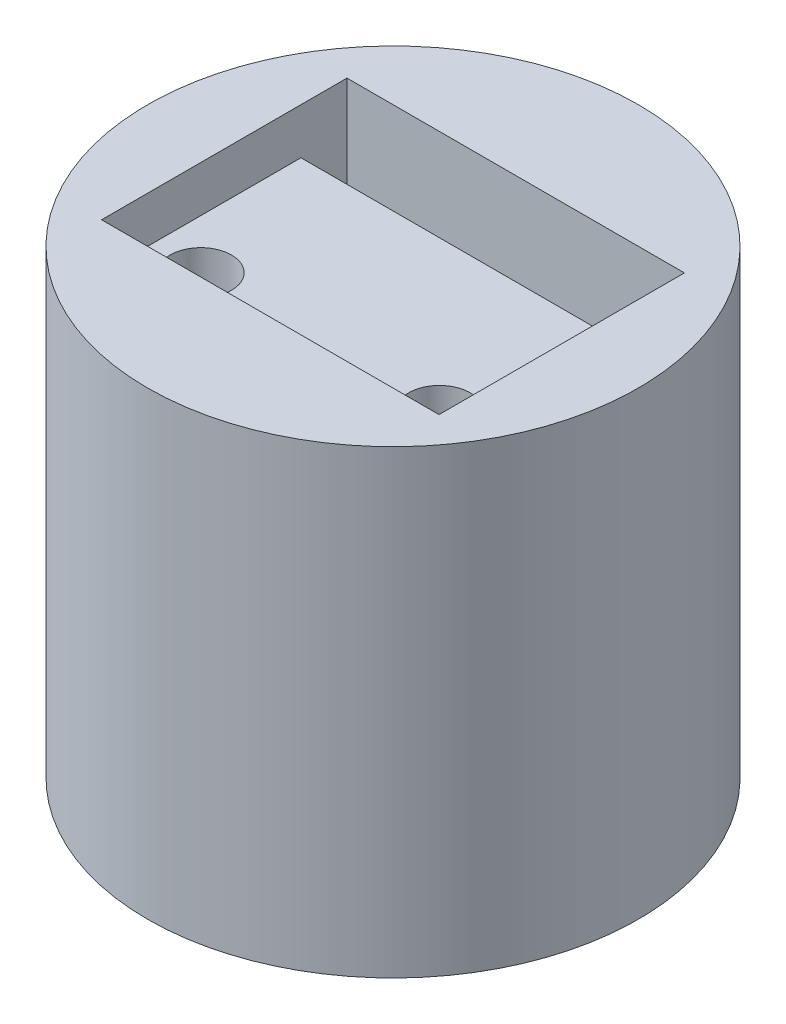
ISO-10303-21;
HEADER;
FILE_DESCRIPTION(('STEP AP214'),'2;1');
FILE_NAME('part.step','',(''),(''),'','','');
FILE_SCHEMA(('AUTOMOTIVE_DESIGN { 1 0 10303 214 1 1 1 1 }'));
ENDSEC;
DATA;
#1=APPLICATION_CONTEXT('core data for automotive mechanical design processes');
#2=APPLICATION_PROTOCOL_DEFINITION('international standard','automotive_design',2000,#1);
#3=PRODUCT_CONTEXT('',#1,'mechanical');
#4=PRODUCT('Part','Part','',(#3));
#5=PRODUCT_RELATED_PRODUCT_CATEGORY('part','',(#4));
#6=PRODUCT_DEFINITION_FORMATION('','',#4);
#7=PRODUCT_DEFINITION_CONTEXT('part definition',#1,'design');
#8=PRODUCT_DEFINITION('design','',#6,#7);
#9=PRODUCT_DEFINITION_SHAPE('','',#8);
#10=(LENGTH_UNIT() NAMED_UNIT(*) SI_UNIT(.MILLI.,.METRE.));
#11=(NAMED_UNIT(*) PLANE_ANGLE_UNIT() SI_UNIT($,.RADIAN.));
#12=(NAMED_UNIT(*) SI_UNIT($,.STERADIAN.) SOLID_ANGLE_UNIT());
#13=UNCERTAINTY_MEASURE_WITH_UNIT(LENGTH_MEASURE(1.E-05),#10,'distance_accuracy_value','');
#14=(GEOMETRIC_REPRESENTATION_CONTEXT(3) GLOBAL_UNCERTAINTY_ASSIGNED_CONTEXT((#13)) GLOBAL_UNIT_ASSIGNED_CONTEXT((#10,
#11,#12)) REPRESENTATION_CONTEXT('',''));
#15=CARTESIAN_POINT('',(0.,0.,0.));
#16=DIRECTION('',(0.,0.,1.));
#17=DIRECTION('',(1.,0.,0.));
#18=AXIS2_PLACEMENT_3D('',#15,#16,#17);
#19=CARTESIAN_POINT('',(0.,30.,0.));
#20=DIRECTION('',(0.,-1.,0.));
#21=DIRECTION('',(0.,0.,-1.));
#22=AXIS2_PLACEMENT_3D('',#19,#20,#21);
#23=CYLINDRICAL_SURFACE('',#22,16.);
#24=CARTESIAN_POINT('',(0.,30.,0.));
#25=DIRECTION('',(0.,1.,0.));
#26=DIRECTION('',(0.,0.,1.));
#27=AXIS2_PLACEMENT_3D('',#24,#25,#26);
#28=CIRCLE('',#27,16.);
#29=CARTESIAN_POINT('',(0.,30.,16.));
#30=VERTEX_POINT('',#29);
#31=EDGE_CURVE('E11',#30,#30,#28,.T.);
#32=ORIENTED_EDGE('',*,*,#31,.F.);
#33=EDGE_LOOP('',(#32));
#34=FACE_BOUND('',#33,.T.);
#35=CARTESIAN_POINT('',(0.,0.,0.));
#36=DIRECTION('',(0.,1.,0.));
#37=DIRECTION('',(0.,0.,1.));
#38=AXIS2_PLACEMENT_3D('',#35,#36,#37);
#39=CIRCLE('',#38,16.);
#40=CARTESIAN_POINT('',(0.,0.,16.));
#41=VERTEX_POINT('',#40);
#42=EDGE_CURVE('E40',#41,#41,#39,.T.);
#43=ORIENTED_EDGE('',*,*,#42,.T.);
#44=EDGE_LOOP('',(#43));
#45=FACE_BOUND('',#44,.T.);
#46=ADVANCED_FACE('F37',(#34,#45),#23,.T.);
#47=CARTESIAN_POINT('',(0.,30.,0.));
#48=DIRECTION('',(0.,1.,0.));
#49=DIRECTION('',(0.,0.,1.));
#50=AXIS2_PLACEMENT_3D('',#47,#48,#49);
#51=PLANE('',#50);
#52=DIRECTION('',(0.,0.,1.));
#53=VECTOR('',#52,1.);
#54=CARTESIAN_POINT('',(-11.,30.,8.));
#55=LINE('',#54,#53);
#56=CARTESIAN_POINT('',(-11.,30.,-8.));
#57=VERTEX_POINT('',#56);
#58=CARTESIAN_POINT('',(-11.,30.,8.));
#59=VERTEX_POINT('',#58);
#60=EDGE_CURVE('E59',#57,#59,#55,.T.);
#61=ORIENTED_EDGE('',*,*,#60,.F.);
#62=DIRECTION('',(-1.,0.,0.));
#63=VECTOR('',#62,1.);
#64=CARTESIAN_POINT('',(11.,30.,-8.));
#65=LINE('',#64,#63);
#66=CARTESIAN_POINT('',(11.,30.,-8.));
#67=VERTEX_POINT('',#66);
#68=EDGE_CURVE('E129',#67,#57,#65,.T.);
#69=ORIENTED_EDGE('',*,*,#68,.F.);
#70=DIRECTION('',(0.,0.,-1.));
#71=VECTOR('',#70,1.);
#72=CARTESIAN_POINT('',(11.,30.,8.));
#73=LINE('',#72,#71);
#74=CARTESIAN_POINT('',(11.,30.,8.));
#75=VERTEX_POINT('',#74);
#76=EDGE_CURVE('E140',#75,#67,#73,.T.);
#77=ORIENTED_EDGE('',*,*,#76,.F.);
#78=DIRECTION('',(1.,0.,0.));
#79=VECTOR('',#78,1.);
#80=CARTESIAN_POINT('',(11.,30.,8.));
#81=LINE('',#80,#79);
#82=EDGE_CURVE('E137',#59,#75,#81,.T.);
#83=ORIENTED_EDGE('',*,*,#82,.F.);
#84=EDGE_LOOP('',(#61,#69,#77,#83));
#85=FACE_BOUND('',#84,.T.);
#86=ORIENTED_EDGE('',*,*,#31,.T.);
#87=EDGE_LOOP('',(#86));
#88=FACE_BOUND('',#87,.T.);
#89=ADVANCED_FACE('F157',(#85,#88),#51,.T.);
#90=CARTESIAN_POINT('',(0.,0.,0.));
#91=DIRECTION('',(0.,1.,0.));
#92=DIRECTION('',(0.,0.,1.));
#93=AXIS2_PLACEMENT_3D('',#90,#91,#92);
#94=PLANE('',#93);
#95=ORIENTED_EDGE('',*,*,#42,.F.);
#96=EDGE_LOOP('',(#95));
#97=FACE_BOUND('',#96,.T.);
#98=ADVANCED_FACE('F189',(#97),#94,.F.);
#99=CARTESIAN_POINT('',(-11.,27.,8.));
#100=DIRECTION('',(-1.,0.,0.));
#101=DIRECTION('',(0.,0.,1.));
#102=AXIS2_PLACEMENT_3D('',#99,#100,#101);
#103=PLANE('',#102);
#104=ORIENTED_EDGE('',*,*,#60,.T.);
#105=DIRECTION('',(0.,1.,0.));
#106=VECTOR('',#105,1.);
#107=CARTESIAN_POINT('',(-11.,27.,8.));
#108=LINE('',#107,#106);
#109=CARTESIAN_POINT('',(-11.,27.,8.));
#110=VERTEX_POINT('',#109);
#111=EDGE_CURVE('E135',#110,#59,#108,.T.);
#112=ORIENTED_EDGE('',*,*,#111,.F.);
#113=DIRECTION('',(0.,0.,1.));
#114=VECTOR('',#113,1.);
#115=CARTESIAN_POINT('',(-11.,27.,8.));
#116=LINE('',#115,#114);
#117=CARTESIAN_POINT('',(-11.,27.,-5.));
#118=VERTEX_POINT('',#117);
#119=EDGE_CURVE('E94',#118,#110,#116,.T.);
#120=ORIENTED_EDGE('',*,*,#119,.F.);
#121=DIRECTION('',(0.,1.,0.));
#122=VECTOR('',#121,1.);
#123=CARTESIAN_POINT('',(-11.,18.24,-5.));
#124=LINE('',#123,#122);
#125=CARTESIAN_POINT('',(-11.,18.24,-5.));
#126=VERTEX_POINT('',#125);
#127=EDGE_CURVE('E51',#126,#118,#124,.T.);
#128=ORIENTED_EDGE('',*,*,#127,.F.);
#129=DIRECTION('',(0.,0.,1.));
#130=VECTOR('',#129,1.);
#131=CARTESIAN_POINT('',(-11.,18.24,-8.));
#132=LINE('',#131,#130);
#133=CARTESIAN_POINT('',(-11.,18.24,-8.));
#134=VERTEX_POINT('',#133);
#135=EDGE_CURVE('E92',#134,#126,#132,.T.);
#136=ORIENTED_EDGE('',*,*,#135,.F.);
#137=DIRECTION('',(0.,1.,0.));
#138=VECTOR('',#137,1.);
#139=CARTESIAN_POINT('',(-11.,27.,-8.));
#140=LINE('',#139,#138);
#141=EDGE_CURVE('E145',#134,#57,#140,.T.);
#142=ORIENTED_EDGE('',*,*,#141,.T.);
#143=EDGE_LOOP('',(#104,#112,#120,#128,#136,#142));
#144=FACE_BOUND('',#143,.T.);
#145=ADVANCED_FACE('F90',(#144),#103,.F.);
#146=CARTESIAN_POINT('',(11.,27.,-8.));
#147=DIRECTION('',(0.,0.,-1.));
#148=DIRECTION('',(-1.,0.,0.));
#149=AXIS2_PLACEMENT_3D('',#146,#147,#148);
#150=PLANE('',#149);
#151=ORIENTED_EDGE('',*,*,#68,.T.);
#152=ORIENTED_EDGE('',*,*,#141,.F.);
#153=DIRECTION('',(-1.,0.,0.));
#154=VECTOR('',#153,1.);
#155=CARTESIAN_POINT('',(-11.,18.24,-8.));
#156=LINE('',#155,#154);
#157=CARTESIAN_POINT('',(11.,18.24,-8.));
#158=VERTEX_POINT('',#157);
#159=EDGE_CURVE('E96',#158,#134,#156,.T.);
#160=ORIENTED_EDGE('',*,*,#159,.F.);
#161=DIRECTION('',(0.,1.,0.));
#162=VECTOR('',#161,1.);
#163=CARTESIAN_POINT('',(11.,27.,-8.));
#164=LINE('',#163,#162);
#165=EDGE_CURVE('E147',#158,#67,#164,.T.);
#166=ORIENTED_EDGE('',*,*,#165,.T.);
#167=EDGE_LOOP('',(#151,#152,#160,#166));
#168=FACE_BOUND('',#167,.T.);
#169=ADVANCED_FACE('F200',(#168),#150,.F.);
#170=CARTESIAN_POINT('',(11.,27.,8.));
#171=DIRECTION('',(1.,0.,0.));
#172=DIRECTION('',(0.,0.,-1.));
#173=AXIS2_PLACEMENT_3D('',#170,#171,#172);
#174=PLANE('',#173);
#175=ORIENTED_EDGE('',*,*,#76,.T.);
#176=ORIENTED_EDGE('',*,*,#165,.F.);
#177=DIRECTION('',(0.,0.,-1.));
#178=VECTOR('',#177,1.);
#179=CARTESIAN_POINT('',(11.,18.24,-8.));
#180=LINE('',#179,#178);
#181=CARTESIAN_POINT('',(11.,18.24,-5.));
#182=VERTEX_POINT('',#181);
#183=EDGE_CURVE('E104',#182,#158,#180,.T.);
#184=ORIENTED_EDGE('',*,*,#183,.F.);
#185=DIRECTION('',(0.,1.,0.));
#186=VECTOR('',#185,1.);
#187=CARTESIAN_POINT('',(11.,18.24,-5.));
#188=LINE('',#187,#186);
#189=CARTESIAN_POINT('',(11.,27.,-5.));
#190=VERTEX_POINT('',#189);
#191=EDGE_CURVE('E95',#182,#190,#188,.T.);
#192=ORIENTED_EDGE('',*,*,#191,.T.);
#193=DIRECTION('',(0.,0.,-1.));
#194=VECTOR('',#193,1.);
#195=CARTESIAN_POINT('',(11.,27.,8.));
#196=LINE('',#195,#194);
#197=CARTESIAN_POINT('',(11.,27.,8.));
#198=VERTEX_POINT('',#197);
#199=EDGE_CURVE('E132',#198,#190,#196,.T.);
#200=ORIENTED_EDGE('',*,*,#199,.F.);
#201=DIRECTION('',(0.,1.,0.));
#202=VECTOR('',#201,1.);
#203=CARTESIAN_POINT('',(11.,27.,8.));
#204=LINE('',#203,#202);
#205=EDGE_CURVE('E149',#198,#75,#204,.T.);
#206=ORIENTED_EDGE('',*,*,#205,.T.);
#207=EDGE_LOOP('',(#175,#176,#184,#192,#200,#206));
#208=FACE_BOUND('',#207,.T.);
#209=ADVANCED_FACE('F161',(#208),#174,.F.);
#210=CARTESIAN_POINT('',(11.,27.,8.));
#211=DIRECTION('',(0.,0.,1.));
#212=DIRECTION('',(1.,0.,0.));
#213=AXIS2_PLACEMENT_3D('',#210,#211,#212);
#214=PLANE('',#213);
#215=ORIENTED_EDGE('',*,*,#82,.T.);
#216=ORIENTED_EDGE('',*,*,#205,.F.);
#217=DIRECTION('',(1.,0.,0.));
#218=VECTOR('',#217,1.);
#219=CARTESIAN_POINT('',(11.,27.,8.));
#220=LINE('',#219,#218);
#221=EDGE_CURVE('E128',#110,#198,#220,.T.);
#222=ORIENTED_EDGE('',*,*,#221,.F.);
#223=ORIENTED_EDGE('',*,*,#111,.T.);
#224=EDGE_LOOP('',(#215,#216,#222,#223));
#225=FACE_BOUND('',#224,.T.);
#226=ADVANCED_FACE('F154',(#225),#214,.F.);
#227=CARTESIAN_POINT('',(0.,27.,0.));
#228=DIRECTION('',(0.,1.,0.));
#229=DIRECTION('',(0.,0.,1.));
#230=AXIS2_PLACEMENT_3D('',#227,#228,#229);
#231=PLANE('',#230);
#232=DIRECTION('',(1.,0.,0.));
#233=VECTOR('',#232,1.);
#234=CARTESIAN_POINT('',(-11.,27.,-5.));
#235=LINE('',#234,#233);
#236=EDGE_CURVE('E108',#118,#190,#235,.T.);
#237=ORIENTED_EDGE('',*,*,#236,.F.);
#238=ORIENTED_EDGE('',*,*,#119,.T.);
#239=ORIENTED_EDGE('',*,*,#221,.T.);
#240=ORIENTED_EDGE('',*,*,#199,.T.);
#241=EDGE_LOOP('',(#237,#238,#239,#240));
#242=FACE_BOUND('',#241,.T.);
#243=CARTESIAN_POINT('',(-7.78,27.,4.75268753942643));
#244=DIRECTION('',(0.,1.,0.));
#245=DIRECTION('',(0.,0.,1.));
#246=AXIS2_PLACEMENT_3D('',#243,#244,#245);
#247=CIRCLE('',#246,2.);
#248=CARTESIAN_POINT('',(-7.78,27.,6.75268753942643));
#249=VERTEX_POINT('',#248);
#250=EDGE_CURVE('E119',#249,#249,#247,.T.);
#251=ORIENTED_EDGE('',*,*,#250,.F.);
#252=EDGE_LOOP('',(#251));
#253=FACE_BOUND('',#252,.T.);
#254=CARTESIAN_POINT('',(7.78,27.,4.75268753942643));
#255=DIRECTION('',(0.,1.,0.));
#256=DIRECTION('',(0.,0.,1.));
#257=AXIS2_PLACEMENT_3D('',#254,#255,#256);
#258=CIRCLE('',#257,2.);
#259=CARTESIAN_POINT('',(7.78,27.,6.75268753942643));
#260=VERTEX_POINT('',#259);
#261=EDGE_CURVE('E114',#260,#260,#258,.T.);
#262=ORIENTED_EDGE('',*,*,#261,.F.);
#263=EDGE_LOOP('',(#262));
#264=FACE_BOUND('',#263,.T.);
#265=ADVANCED_FACE('F164',(#242,#253,#264),#231,.T.);
#266=CARTESIAN_POINT('',(7.78,20.3,4.75268753942643));
#267=DIRECTION('',(0.,1.,0.));
#268=DIRECTION('',(0.,0.,1.));
#269=AXIS2_PLACEMENT_3D('',#266,#267,#268);
#270=CYLINDRICAL_SURFACE('',#269,2.);
#271=CARTESIAN_POINT('',(7.78,20.3,4.75268753942643));
#272=DIRECTION('',(0.,1.,0.));
#273=DIRECTION('',(0.,0.,1.));
#274=AXIS2_PLACEMENT_3D('',#271,#272,#273);
#275=CIRCLE('',#274,2.);
#276=CARTESIAN_POINT('',(7.78,20.3,6.75268753942643));
#277=VERTEX_POINT('',#276);
#278=EDGE_CURVE('E122',#277,#277,#275,.T.);
#279=ORIENTED_EDGE('',*,*,#278,.F.);
#280=EDGE_LOOP('',(#279));
#281=FACE_BOUND('',#280,.T.);
#282=ORIENTED_EDGE('',*,*,#261,.T.);
#283=EDGE_LOOP('',(#282));
#284=FACE_BOUND('',#283,.T.);
#285=ADVANCED_FACE('F167',(#281,#284),#270,.F.);
#286=CARTESIAN_POINT('',(7.78,20.3,4.75268753942643));
#287=DIRECTION('',(0.,1.,0.));
#288=DIRECTION('',(0.,0.,1.));
#289=AXIS2_PLACEMENT_3D('',#286,#287,#288);
#290=PLANE('',#289);
#291=ORIENTED_EDGE('',*,*,#278,.T.);
#292=EDGE_LOOP('',(#291));
#293=FACE_BOUND('',#292,.T.);
#294=ADVANCED_FACE('F174',(#293),#290,.T.);
#295=CARTESIAN_POINT('',(-7.78,20.3,4.75268753942643));
#296=DIRECTION('',(0.,1.,0.));
#297=DIRECTION('',(0.,0.,1.));
#298=AXIS2_PLACEMENT_3D('',#295,#296,#297);
#299=CYLINDRICAL_SURFACE('',#298,2.);
#300=CARTESIAN_POINT('',(-7.78,20.3,4.75268753942643));
#301=DIRECTION('',(0.,1.,0.));
#302=DIRECTION('',(0.,0.,1.));
#303=AXIS2_PLACEMENT_3D('',#300,#301,#302);
#304=CIRCLE('',#303,2.);
#305=CARTESIAN_POINT('',(-7.78,20.3,6.75268753942643));
#306=VERTEX_POINT('',#305);
#307=EDGE_CURVE('E116',#306,#306,#304,.T.);
#308=ORIENTED_EDGE('',*,*,#307,.F.);
#309=EDGE_LOOP('',(#308));
#310=FACE_BOUND('',#309,.T.);
#311=ORIENTED_EDGE('',*,*,#250,.T.);
#312=EDGE_LOOP('',(#311));
#313=FACE_BOUND('',#312,.T.);
#314=ADVANCED_FACE('F180',(#310,#313),#299,.F.);
#315=CARTESIAN_POINT('',(-7.78,20.3,4.75268753942643));
#316=DIRECTION('',(0.,1.,0.));
#317=DIRECTION('',(0.,0.,1.));
#318=AXIS2_PLACEMENT_3D('',#315,#316,#317);
#319=PLANE('',#318);
#320=ORIENTED_EDGE('',*,*,#307,.T.);
#321=EDGE_LOOP('',(#320));
#322=FACE_BOUND('',#321,.T.);
#323=ADVANCED_FACE('F236',(#322),#319,.T.);
#324=CARTESIAN_POINT('',(-11.,18.24,-5.));
#325=DIRECTION('',(0.,0.,1.));
#326=DIRECTION('',(1.,0.,0.));
#327=AXIS2_PLACEMENT_3D('',#324,#325,#326);
#328=PLANE('',#327);
#329=ORIENTED_EDGE('',*,*,#236,.T.);
#330=ORIENTED_EDGE('',*,*,#191,.F.);
#331=DIRECTION('',(1.,0.,0.));
#332=VECTOR('',#331,1.);
#333=CARTESIAN_POINT('',(-11.,18.24,-5.));
#334=LINE('',#333,#332);
#335=EDGE_CURVE('E99',#126,#182,#334,.T.);
#336=ORIENTED_EDGE('',*,*,#335,.F.);
#337=ORIENTED_EDGE('',*,*,#127,.T.);
#338=EDGE_LOOP('',(#329,#330,#336,#337));
#339=FACE_BOUND('',#338,.T.);
#340=ADVANCED_FACE('F100',(#339),#328,.F.);
#341=CARTESIAN_POINT('',(0.,18.24,0.));
#342=DIRECTION('',(0.,1.,0.));
#343=DIRECTION('',(0.,0.,1.));
#344=AXIS2_PLACEMENT_3D('',#341,#342,#343);
#345=PLANE('',#344);
#346=ORIENTED_EDGE('',*,*,#135,.T.);
#347=ORIENTED_EDGE('',*,*,#335,.T.);
#348=ORIENTED_EDGE('',*,*,#183,.T.);
#349=ORIENTED_EDGE('',*,*,#159,.T.);
#350=EDGE_LOOP('',(#346,#347,#348,#349));
#351=FACE_BOUND('',#350,.T.);
#352=ADVANCED_FACE('F106',(#351),#345,.T.);
#353=CLOSED_SHELL('',(#46,#89,#98,#145,#169,#209,#226,#265,#285,#294,#314,#323,#340,#352));
#354=MANIFOLD_SOLID_BREP('B2',#353);
#355=ADVANCED_BREP_SHAPE_REPRESENTATION('',(#18,#354),#14);
#356=SHAPE_DEFINITION_REPRESENTATION(#9,#355);
ENDSEC;
END-ISO-10303-21;
